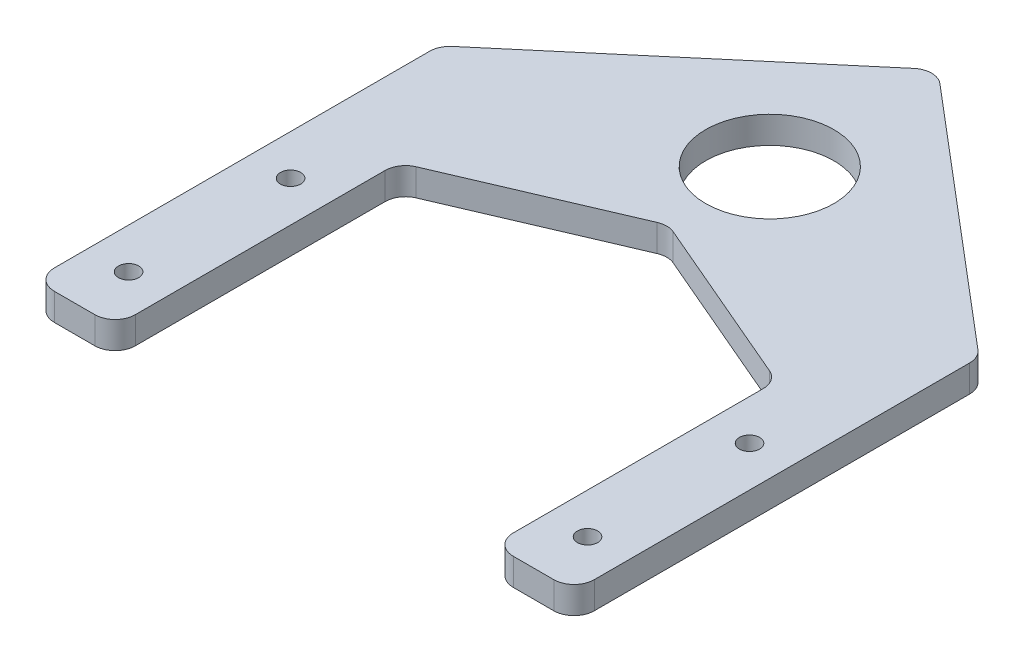
ISO-10303-21;
HEADER;
FILE_DESCRIPTION(('STEP AP214'),'2;1');
FILE_NAME('part.step','',(''),(''),'','','');
FILE_SCHEMA(('AUTOMOTIVE_DESIGN { 1 0 10303 214 1 1 1 1 }'));
ENDSEC;
DATA;
#1=APPLICATION_CONTEXT('core data for automotive mechanical design processes');
#2=APPLICATION_PROTOCOL_DEFINITION('international standard','automotive_design',2000,#1);
#3=PRODUCT_CONTEXT('',#1,'mechanical');
#4=PRODUCT('Part','Part','',(#3));
#5=PRODUCT_RELATED_PRODUCT_CATEGORY('part','',(#4));
#6=PRODUCT_DEFINITION_FORMATION('','',#4);
#7=PRODUCT_DEFINITION_CONTEXT('part definition',#1,'design');
#8=PRODUCT_DEFINITION('design','',#6,#7);
#9=PRODUCT_DEFINITION_SHAPE('','',#8);
#10=(LENGTH_UNIT() NAMED_UNIT(*) SI_UNIT(.MILLI.,.METRE.));
#11=(NAMED_UNIT(*) PLANE_ANGLE_UNIT() SI_UNIT($,.RADIAN.));
#12=(NAMED_UNIT(*) SI_UNIT($,.STERADIAN.) SOLID_ANGLE_UNIT());
#13=UNCERTAINTY_MEASURE_WITH_UNIT(LENGTH_MEASURE(1.E-05),#10,'distance_accuracy_value','');
#14=(GEOMETRIC_REPRESENTATION_CONTEXT(3) GLOBAL_UNCERTAINTY_ASSIGNED_CONTEXT((#13)) GLOBAL_UNIT_ASSIGNED_CONTEXT((#10,
#11,#12)) REPRESENTATION_CONTEXT('',''));
#15=CARTESIAN_POINT('',(0.,0.,0.));
#16=DIRECTION('',(0.,0.,1.));
#17=DIRECTION('',(1.,0.,0.));
#18=AXIS2_PLACEMENT_3D('',#15,#16,#17);
#19=CARTESIAN_POINT('',(0.,4.,0.));
#20=DIRECTION('',(0.,-1.,0.));
#21=DIRECTION('',(0.,0.,-1.));
#22=AXIS2_PLACEMENT_3D('',#19,#20,#21);
#23=PLANE('',#22);
#24=DIRECTION('',(0.,0.,1.));
#25=VECTOR('',#24,1.);
#26=CARTESIAN_POINT('',(0.,4.,0.));
#27=LINE('',#26,#25);
#28=CARTESIAN_POINT('',(0.,4.,-58.6102472415676));
#29=VERTEX_POINT('',#28);
#30=CARTESIAN_POINT('',(0.,4.,-3.));
#31=VERTEX_POINT('',#30);
#32=EDGE_CURVE('E220',#29,#31,#27,.T.);
#33=ORIENTED_EDGE('',*,*,#32,.T.);
#34=CARTESIAN_POINT('',(3.,4.,-3.));
#35=DIRECTION('',(0.,-1.,0.));
#36=DIRECTION('',(0.,0.,-1.));
#37=AXIS2_PLACEMENT_3D('',#34,#35,#36);
#38=CIRCLE('',#37,3.);
#39=CARTESIAN_POINT('',(3.,4.,0.));
#40=VERTEX_POINT('',#39);
#41=EDGE_CURVE('E264',#31,#40,#38,.F.);
#42=ORIENTED_EDGE('',*,*,#41,.T.);
#43=DIRECTION('',(1.,0.,0.));
#44=VECTOR('',#43,1.);
#45=CARTESIAN_POINT('',(12.,4.,0.));
#46=LINE('',#45,#44);
#47=CARTESIAN_POINT('',(9.,4.,0.));
#48=VERTEX_POINT('',#47);
#49=EDGE_CURVE('E200',#40,#48,#46,.T.);
#50=ORIENTED_EDGE('',*,*,#49,.T.);
#51=CARTESIAN_POINT('',(9.,4.,-3.));
#52=DIRECTION('',(0.,-1.,0.));
#53=DIRECTION('',(0.,0.,-1.));
#54=AXIS2_PLACEMENT_3D('',#51,#52,#53);
#55=CIRCLE('',#54,3.);
#56=CARTESIAN_POINT('',(12.,4.,-3.00000000000002));
#57=VERTEX_POINT('',#56);
#58=EDGE_CURVE('E254',#48,#57,#55,.F.);
#59=ORIENTED_EDGE('',*,*,#58,.T.);
#60=DIRECTION('',(0.,0.,-1.));
#61=VECTOR('',#60,1.);
#62=CARTESIAN_POINT('',(12.,4.,-42.));
#63=LINE('',#62,#61);
#64=CARTESIAN_POINT('',(12.,4.,-40.0218115260583));
#65=VERTEX_POINT('',#64);
#66=EDGE_CURVE('E329',#57,#65,#63,.T.);
#67=ORIENTED_EDGE('',*,*,#66,.T.);
#68=CARTESIAN_POINT('',(15.,4.,-40.0218115260583));
#69=DIRECTION('',(0.,-1.,0.));
#70=DIRECTION('',(0.,0.,-1.));
#71=AXIS2_PLACEMENT_3D('',#68,#69,#70);
#72=CIRCLE('',#71,3.);
#73=CARTESIAN_POINT('',(13.8182421042625,4.,-42.7792466161125));
#74=VERTEX_POINT('',#73);
#75=EDGE_CURVE('E11',#65,#74,#72,.T.);
#76=ORIENTED_EDGE('',*,*,#75,.T.);
#77=DIRECTION('',(0.919145030018058,0.,-0.393919298579168));
#78=VECTOR('',#77,1.);
#79=CARTESIAN_POINT('',(12.,4.,-42.));
#80=LINE('',#79,#78);
#81=CARTESIAN_POINT('',(38.8182421042625,4.,-53.4935323303982));
#82=VERTEX_POINT('',#81);
#83=EDGE_CURVE('E327',#74,#82,#80,.T.);
#84=ORIENTED_EDGE('',*,*,#83,.T.);
#85=CARTESIAN_POINT('',(40.,4.,-50.736097240344));
#86=DIRECTION('',(0.,-1.,0.));
#87=DIRECTION('',(0.,0.,-1.));
#88=AXIS2_PLACEMENT_3D('',#85,#86,#87);
#89=CIRCLE('',#88,3.);
#90=CARTESIAN_POINT('',(41.1817578957375,4.,-53.4935323303982));
#91=VERTEX_POINT('',#90);
#92=EDGE_CURVE('E315',#82,#91,#89,.T.);
#93=ORIENTED_EDGE('',*,*,#92,.T.);
#94=DIRECTION('',(0.919145030018058,0.,0.393919298579168));
#95=VECTOR('',#94,1.);
#96=CARTESIAN_POINT('',(40.,4.,-54.));
#97=LINE('',#96,#95);
#98=CARTESIAN_POINT('',(66.1817578957375,4.,-42.7792466161125));
#99=VERTEX_POINT('',#98);
#100=EDGE_CURVE('E331',#91,#99,#97,.T.);
#101=ORIENTED_EDGE('',*,*,#100,.T.);
#102=CARTESIAN_POINT('',(65.,4.,-40.0218115260583));
#103=DIRECTION('',(0.,-1.,0.));
#104=DIRECTION('',(0.,0.,-1.));
#105=AXIS2_PLACEMENT_3D('',#102,#103,#104);
#106=CIRCLE('',#105,3.);
#107=CARTESIAN_POINT('',(68.,4.,-40.0218115260583));
#108=VERTEX_POINT('',#107);
#109=EDGE_CURVE('E306',#99,#108,#106,.T.);
#110=ORIENTED_EDGE('',*,*,#109,.T.);
#111=DIRECTION('',(0.,0.,1.));
#112=VECTOR('',#111,1.);
#113=CARTESIAN_POINT('',(68.,4.,0.));
#114=LINE('',#113,#112);
#115=CARTESIAN_POINT('',(68.,4.,-3.00000000000001));
#116=VERTEX_POINT('',#115);
#117=EDGE_CURVE('E340',#108,#116,#114,.T.);
#118=ORIENTED_EDGE('',*,*,#117,.T.);
#119=CARTESIAN_POINT('',(71.,4.,-3.00000000000001));
#120=DIRECTION('',(0.,-1.,0.));
#121=DIRECTION('',(0.,0.,-1.));
#122=AXIS2_PLACEMENT_3D('',#119,#120,#121);
#123=CIRCLE('',#122,3.);
#124=CARTESIAN_POINT('',(71.,4.,0.));
#125=VERTEX_POINT('',#124);
#126=EDGE_CURVE('E260',#116,#125,#123,.F.);
#127=ORIENTED_EDGE('',*,*,#126,.T.);
#128=DIRECTION('',(1.,0.,0.));
#129=VECTOR('',#128,1.);
#130=CARTESIAN_POINT('',(80.,4.,0.));
#131=LINE('',#130,#129);
#132=CARTESIAN_POINT('',(77.,4.,0.));
#133=VERTEX_POINT('',#132);
#134=EDGE_CURVE('E343',#125,#133,#131,.T.);
#135=ORIENTED_EDGE('',*,*,#134,.T.);
#136=CARTESIAN_POINT('',(77.,4.,-3.00000000000001));
#137=DIRECTION('',(0.,-1.,0.));
#138=DIRECTION('',(0.,0.,-1.));
#139=AXIS2_PLACEMENT_3D('',#136,#137,#138);
#140=CIRCLE('',#139,3.);
#141=CARTESIAN_POINT('',(80.,4.,-3.00000000000002));
#142=VERTEX_POINT('',#141);
#143=EDGE_CURVE('E259',#133,#142,#140,.F.);
#144=ORIENTED_EDGE('',*,*,#143,.T.);
#145=DIRECTION('',(0.,0.,-1.));
#146=VECTOR('',#145,1.);
#147=CARTESIAN_POINT('',(80.,4.,-60.));
#148=LINE('',#147,#146);
#149=CARTESIAN_POINT('',(80.,4.,-58.6102472415676));
#150=VERTEX_POINT('',#149);
#151=EDGE_CURVE('E350',#142,#150,#148,.T.);
#152=ORIENTED_EDGE('',*,*,#151,.T.);
#153=CARTESIAN_POINT('',(77.,4.,-58.6102472415676));
#154=DIRECTION('',(0.,-1.,0.));
#155=DIRECTION('',(0.,0.,-1.));
#156=AXIS2_PLACEMENT_3D('',#153,#154,#155);
#157=CIRCLE('',#156,3.);
#158=CARTESIAN_POINT('',(78.9398921562924,4.,-60.8986568250896));
#159=VERTEX_POINT('',#158);
#160=EDGE_CURVE('E261',#150,#159,#157,.F.);
#161=ORIENTED_EDGE('',*,*,#160,.T.);
#162=DIRECTION('',(-0.762803194507315,0.,-0.646630718764146));
#163=VECTOR('',#162,1.);
#164=CARTESIAN_POINT('',(40.,4.,-93.9081285144222));
#165=LINE('',#164,#163);
#166=CARTESIAN_POINT('',(41.9398921562924,4.,-92.2636757009301));
#167=VERTEX_POINT('',#166);
#168=EDGE_CURVE('E348',#159,#167,#165,.T.);
#169=ORIENTED_EDGE('',*,*,#168,.T.);
#170=CARTESIAN_POINT('',(40.,4.,-89.9752661174082));
#171=DIRECTION('',(0.,-1.,0.));
#172=DIRECTION('',(0.,0.,-1.));
#173=AXIS2_PLACEMENT_3D('',#170,#171,#172);
#174=CIRCLE('',#173,3.);
#175=CARTESIAN_POINT('',(38.0601078437076,4.,-92.2636757009301));
#176=VERTEX_POINT('',#175);
#177=EDGE_CURVE('E61',#167,#176,#174,.F.);
#178=ORIENTED_EDGE('',*,*,#177,.T.);
#179=DIRECTION('',(-0.762803194507315,0.,0.646630718764146));
#180=VECTOR('',#179,1.);
#181=CARTESIAN_POINT('',(0.,4.,-60.));
#182=LINE('',#181,#180);
#183=CARTESIAN_POINT('',(1.06010784370756,4.,-60.8986568250896));
#184=VERTEX_POINT('',#183);
#185=EDGE_CURVE('E353',#176,#184,#182,.T.);
#186=ORIENTED_EDGE('',*,*,#185,.T.);
#187=CARTESIAN_POINT('',(3.,4.,-58.6102472415676));
#188=DIRECTION('',(0.,-1.,0.));
#189=DIRECTION('',(0.,0.,-1.));
#190=AXIS2_PLACEMENT_3D('',#187,#188,#189);
#191=CIRCLE('',#190,3.);
#192=EDGE_CURVE('E263',#184,#29,#191,.F.);
#193=ORIENTED_EDGE('',*,*,#192,.T.);
#194=EDGE_LOOP('',(#33,#42,#50,#59,#67,#76,#84,#93,#101,#110,#118,#127,#135,#144,#152,#161,#169,
#178,#186,#193));
#195=FACE_BOUND('',#194,.T.);
#196=CARTESIAN_POINT('',(6.,4.,-32.));
#197=DIRECTION('',(0.,1.,0.));
#198=DIRECTION('',(0.,0.,1.));
#199=AXIS2_PLACEMENT_3D('',#196,#197,#198);
#200=CIRCLE('',#199,1.5);
#201=CARTESIAN_POINT('',(6.,4.,-30.5));
#202=VERTEX_POINT('',#201);
#203=EDGE_CURVE('E208',#202,#202,#200,.T.);
#204=ORIENTED_EDGE('',*,*,#203,.F.);
#205=EDGE_LOOP('',(#204));
#206=FACE_BOUND('',#205,.T.);
#207=CARTESIAN_POINT('',(6.,4.,-8.));
#208=DIRECTION('',(0.,1.,0.));
#209=DIRECTION('',(0.,0.,1.));
#210=AXIS2_PLACEMENT_3D('',#207,#208,#209);
#211=CIRCLE('',#210,1.5);
#212=CARTESIAN_POINT('',(6.,4.,-6.5));
#213=VERTEX_POINT('',#212);
#214=EDGE_CURVE('E496',#213,#213,#211,.T.);
#215=ORIENTED_EDGE('',*,*,#214,.F.);
#216=EDGE_LOOP('',(#215));
#217=FACE_BOUND('',#216,.T.);
#218=CARTESIAN_POINT('',(74.,4.,-8.));
#219=DIRECTION('',(0.,1.,0.));
#220=DIRECTION('',(0.,0.,-1.));
#221=AXIS2_PLACEMENT_3D('',#218,#219,#220);
#222=CIRCLE('',#221,1.50000000000001);
#223=CARTESIAN_POINT('',(74.,4.,-9.50000000000001));
#224=VERTEX_POINT('',#223);
#225=EDGE_CURVE('E504',#224,#224,#222,.T.);
#226=ORIENTED_EDGE('',*,*,#225,.F.);
#227=EDGE_LOOP('',(#226));
#228=FACE_BOUND('',#227,.T.);
#229=CARTESIAN_POINT('',(40.,4.,-69.));
#230=DIRECTION('',(0.,1.,0.));
#231=DIRECTION('',(0.,0.,1.));
#232=AXIS2_PLACEMENT_3D('',#229,#230,#231);
#233=CIRCLE('',#232,9.50000000000001);
#234=CARTESIAN_POINT('',(40.,4.,-59.5));
#235=VERTEX_POINT('',#234);
#236=EDGE_CURVE('E509',#235,#235,#233,.T.);
#237=ORIENTED_EDGE('',*,*,#236,.F.);
#238=EDGE_LOOP('',(#237));
#239=FACE_BOUND('',#238,.T.);
#240=CARTESIAN_POINT('',(74.,4.,-32.));
#241=DIRECTION('',(0.,1.,0.));
#242=DIRECTION('',(0.,0.,-1.));
#243=AXIS2_PLACEMENT_3D('',#240,#241,#242);
#244=CIRCLE('',#243,1.50000000000001);
#245=CARTESIAN_POINT('',(74.,4.,-33.5));
#246=VERTEX_POINT('',#245);
#247=EDGE_CURVE('E518',#246,#246,#244,.T.);
#248=ORIENTED_EDGE('',*,*,#247,.F.);
#249=EDGE_LOOP('',(#248));
#250=FACE_BOUND('',#249,.T.);
#251=ADVANCED_FACE('F41',(#195,#206,#217,#228,#239,#250),#23,.F.);
#252=CARTESIAN_POINT('',(0.,0.,0.));
#253=DIRECTION('',(0.,-1.,0.));
#254=DIRECTION('',(0.,0.,-1.));
#255=AXIS2_PLACEMENT_3D('',#252,#253,#254);
#256=PLANE('',#255);
#257=CARTESIAN_POINT('',(40.,0.,-69.));
#258=DIRECTION('',(0.,1.,0.));
#259=DIRECTION('',(0.,0.,1.));
#260=AXIS2_PLACEMENT_3D('',#257,#258,#259);
#261=CIRCLE('',#260,9.50000000000001);
#262=CARTESIAN_POINT('',(40.,0.,-59.5));
#263=VERTEX_POINT('',#262);
#264=EDGE_CURVE('E511',#263,#263,#261,.T.);
#265=ORIENTED_EDGE('',*,*,#264,.T.);
#266=EDGE_LOOP('',(#265));
#267=FACE_BOUND('',#266,.T.);
#268=CARTESIAN_POINT('',(6.,0.,-8.));
#269=DIRECTION('',(0.,1.,0.));
#270=DIRECTION('',(0.,0.,1.));
#271=AXIS2_PLACEMENT_3D('',#268,#269,#270);
#272=CIRCLE('',#271,1.5);
#273=CARTESIAN_POINT('',(6.,0.,-6.5));
#274=VERTEX_POINT('',#273);
#275=EDGE_CURVE('E503',#274,#274,#272,.T.);
#276=ORIENTED_EDGE('',*,*,#275,.T.);
#277=EDGE_LOOP('',(#276));
#278=FACE_BOUND('',#277,.T.);
#279=DIRECTION('',(1.,0.,0.));
#280=VECTOR('',#279,1.);
#281=CARTESIAN_POINT('',(12.,0.,0.));
#282=LINE('',#281,#280);
#283=CARTESIAN_POINT('',(3.,0.,0.));
#284=VERTEX_POINT('',#283);
#285=CARTESIAN_POINT('',(9.,0.,0.));
#286=VERTEX_POINT('',#285);
#287=EDGE_CURVE('E198',#284,#286,#282,.T.);
#288=ORIENTED_EDGE('',*,*,#287,.F.);
#289=CARTESIAN_POINT('',(3.,0.,-3.));
#290=DIRECTION('',(0.,-1.,0.));
#291=DIRECTION('',(0.,0.,-1.));
#292=AXIS2_PLACEMENT_3D('',#289,#290,#291);
#293=CIRCLE('',#292,3.);
#294=CARTESIAN_POINT('',(0.,0.,-3.));
#295=VERTEX_POINT('',#294);
#296=EDGE_CURVE('E178',#284,#295,#293,.T.);
#297=ORIENTED_EDGE('',*,*,#296,.T.);
#298=DIRECTION('',(0.,0.,1.));
#299=VECTOR('',#298,1.);
#300=CARTESIAN_POINT('',(0.,0.,0.));
#301=LINE('',#300,#299);
#302=CARTESIAN_POINT('',(0.,0.,-58.6102472415676));
#303=VERTEX_POINT('',#302);
#304=EDGE_CURVE('E239',#303,#295,#301,.T.);
#305=ORIENTED_EDGE('',*,*,#304,.F.);
#306=CARTESIAN_POINT('',(3.,0.,-58.6102472415676));
#307=DIRECTION('',(0.,-1.,0.));
#308=DIRECTION('',(0.,0.,-1.));
#309=AXIS2_PLACEMENT_3D('',#306,#307,#308);
#310=CIRCLE('',#309,3.);
#311=CARTESIAN_POINT('',(1.06010784370756,0.,-60.8986568250896));
#312=VERTEX_POINT('',#311);
#313=EDGE_CURVE('E187',#303,#312,#310,.T.);
#314=ORIENTED_EDGE('',*,*,#313,.T.);
#315=DIRECTION('',(-0.762803194507315,0.,0.646630718764146));
#316=VECTOR('',#315,1.);
#317=CARTESIAN_POINT('',(0.,0.,-60.));
#318=LINE('',#317,#316);
#319=CARTESIAN_POINT('',(38.0601078437076,0.,-92.2636757009301));
#320=VERTEX_POINT('',#319);
#321=EDGE_CURVE('E240',#320,#312,#318,.T.);
#322=ORIENTED_EDGE('',*,*,#321,.F.);
#323=CARTESIAN_POINT('',(40.,0.,-89.9752661174082));
#324=DIRECTION('',(0.,-1.,0.));
#325=DIRECTION('',(0.,0.,-1.));
#326=AXIS2_PLACEMENT_3D('',#323,#324,#325);
#327=CIRCLE('',#326,3.);
#328=CARTESIAN_POINT('',(41.9398921562924,0.,-92.2636757009301));
#329=VERTEX_POINT('',#328);
#330=EDGE_CURVE('E199',#320,#329,#327,.T.);
#331=ORIENTED_EDGE('',*,*,#330,.T.);
#332=DIRECTION('',(-0.762803194507315,0.,-0.646630718764146));
#333=VECTOR('',#332,1.);
#334=CARTESIAN_POINT('',(40.,0.,-93.9081285144222));
#335=LINE('',#334,#333);
#336=CARTESIAN_POINT('',(78.9398921562924,0.,-60.8986568250896));
#337=VERTEX_POINT('',#336);
#338=EDGE_CURVE('E233',#337,#329,#335,.T.);
#339=ORIENTED_EDGE('',*,*,#338,.F.);
#340=CARTESIAN_POINT('',(77.,0.,-58.6102472415676));
#341=DIRECTION('',(0.,-1.,0.));
#342=DIRECTION('',(0.,0.,-1.));
#343=AXIS2_PLACEMENT_3D('',#340,#341,#342);
#344=CIRCLE('',#343,3.);
#345=CARTESIAN_POINT('',(80.,0.,-58.6102472415676));
#346=VERTEX_POINT('',#345);
#347=EDGE_CURVE('E247',#337,#346,#344,.T.);
#348=ORIENTED_EDGE('',*,*,#347,.T.);
#349=DIRECTION('',(0.,0.,-1.));
#350=VECTOR('',#349,1.);
#351=CARTESIAN_POINT('',(80.,0.,-60.));
#352=LINE('',#351,#350);
#353=CARTESIAN_POINT('',(80.,0.,-3.00000000000002));
#354=VERTEX_POINT('',#353);
#355=EDGE_CURVE('E231',#354,#346,#352,.T.);
#356=ORIENTED_EDGE('',*,*,#355,.F.);
#357=CARTESIAN_POINT('',(77.,0.,-3.00000000000001));
#358=DIRECTION('',(0.,-1.,0.));
#359=DIRECTION('',(0.,0.,-1.));
#360=AXIS2_PLACEMENT_3D('',#357,#358,#359);
#361=CIRCLE('',#360,3.);
#362=CARTESIAN_POINT('',(77.,0.,0.));
#363=VERTEX_POINT('',#362);
#364=EDGE_CURVE('E246',#354,#363,#361,.T.);
#365=ORIENTED_EDGE('',*,*,#364,.T.);
#366=DIRECTION('',(1.,0.,0.));
#367=VECTOR('',#366,1.);
#368=CARTESIAN_POINT('',(80.,0.,0.));
#369=LINE('',#368,#367);
#370=CARTESIAN_POINT('',(71.,0.,0.));
#371=VERTEX_POINT('',#370);
#372=EDGE_CURVE('E226',#371,#363,#369,.T.);
#373=ORIENTED_EDGE('',*,*,#372,.F.);
#374=CARTESIAN_POINT('',(71.,0.,-3.00000000000001));
#375=DIRECTION('',(0.,-1.,0.));
#376=DIRECTION('',(0.,0.,-1.));
#377=AXIS2_PLACEMENT_3D('',#374,#375,#376);
#378=CIRCLE('',#377,3.);
#379=CARTESIAN_POINT('',(68.,0.,-3.00000000000001));
#380=VERTEX_POINT('',#379);
#381=EDGE_CURVE('E244',#371,#380,#378,.T.);
#382=ORIENTED_EDGE('',*,*,#381,.T.);
#383=DIRECTION('',(0.,0.,1.));
#384=VECTOR('',#383,1.);
#385=CARTESIAN_POINT('',(68.,0.,0.));
#386=LINE('',#385,#384);
#387=CARTESIAN_POINT('',(68.,0.,-40.0218115260583));
#388=VERTEX_POINT('',#387);
#389=EDGE_CURVE('E223',#388,#380,#386,.T.);
#390=ORIENTED_EDGE('',*,*,#389,.F.);
#391=CARTESIAN_POINT('',(65.,0.,-40.0218115260583));
#392=DIRECTION('',(0.,-1.,0.));
#393=DIRECTION('',(0.,0.,-1.));
#394=AXIS2_PLACEMENT_3D('',#391,#392,#393);
#395=CIRCLE('',#394,3.);
#396=CARTESIAN_POINT('',(66.1817578957375,0.,-42.7792466161125));
#397=VERTEX_POINT('',#396);
#398=EDGE_CURVE('E308',#388,#397,#395,.F.);
#399=ORIENTED_EDGE('',*,*,#398,.T.);
#400=DIRECTION('',(0.919145030018058,0.,0.393919298579168));
#401=VECTOR('',#400,1.);
#402=CARTESIAN_POINT('',(40.,0.,-54.));
#403=LINE('',#402,#401);
#404=CARTESIAN_POINT('',(41.1817578957375,0.,-53.4935323303982));
#405=VERTEX_POINT('',#404);
#406=EDGE_CURVE('E225',#405,#397,#403,.T.);
#407=ORIENTED_EDGE('',*,*,#406,.F.);
#408=CARTESIAN_POINT('',(40.,0.,-50.736097240344));
#409=DIRECTION('',(0.,-1.,0.));
#410=DIRECTION('',(0.,0.,-1.));
#411=AXIS2_PLACEMENT_3D('',#408,#409,#410);
#412=CIRCLE('',#411,3.);
#413=CARTESIAN_POINT('',(38.8182421042625,0.,-53.4935323303982));
#414=VERTEX_POINT('',#413);
#415=EDGE_CURVE('E309',#405,#414,#412,.F.);
#416=ORIENTED_EDGE('',*,*,#415,.T.);
#417=DIRECTION('',(0.919145030018058,0.,-0.393919298579168));
#418=VECTOR('',#417,1.);
#419=CARTESIAN_POINT('',(12.,0.,-42.));
#420=LINE('',#419,#418);
#421=CARTESIAN_POINT('',(13.8182421042625,0.,-42.7792466161125));
#422=VERTEX_POINT('',#421);
#423=EDGE_CURVE('E211',#422,#414,#420,.T.);
#424=ORIENTED_EDGE('',*,*,#423,.F.);
#425=CARTESIAN_POINT('',(15.,0.,-40.0218115260583));
#426=DIRECTION('',(0.,-1.,0.));
#427=DIRECTION('',(0.,0.,-1.));
#428=AXIS2_PLACEMENT_3D('',#425,#426,#427);
#429=CIRCLE('',#428,3.);
#430=CARTESIAN_POINT('',(12.,0.,-40.0218115260583));
#431=VERTEX_POINT('',#430);
#432=EDGE_CURVE('E47',#422,#431,#429,.F.);
#433=ORIENTED_EDGE('',*,*,#432,.T.);
#434=DIRECTION('',(0.,0.,-1.));
#435=VECTOR('',#434,1.);
#436=CARTESIAN_POINT('',(12.,0.,-42.));
#437=LINE('',#436,#435);
#438=CARTESIAN_POINT('',(12.,0.,-3.00000000000002));
#439=VERTEX_POINT('',#438);
#440=EDGE_CURVE('E210',#439,#431,#437,.T.);
#441=ORIENTED_EDGE('',*,*,#440,.F.);
#442=CARTESIAN_POINT('',(9.,0.,-3.));
#443=DIRECTION('',(0.,-1.,0.));
#444=DIRECTION('',(0.,0.,-1.));
#445=AXIS2_PLACEMENT_3D('',#442,#443,#444);
#446=CIRCLE('',#445,3.);
#447=EDGE_CURVE('E206',#439,#286,#446,.T.);
#448=ORIENTED_EDGE('',*,*,#447,.T.);
#449=EDGE_LOOP('',(#288,#297,#305,#314,#322,#331,#339,#348,#356,#365,#373,#382,#390,#399,#407,
#416,#424,#433,#441,#448));
#450=FACE_BOUND('',#449,.T.);
#451=CARTESIAN_POINT('',(6.,0.,-32.));
#452=DIRECTION('',(0.,1.,0.));
#453=DIRECTION('',(0.,0.,1.));
#454=AXIS2_PLACEMENT_3D('',#451,#452,#453);
#455=CIRCLE('',#454,1.5);
#456=CARTESIAN_POINT('',(6.,0.,-30.5));
#457=VERTEX_POINT('',#456);
#458=EDGE_CURVE('E212',#457,#457,#455,.T.);
#459=ORIENTED_EDGE('',*,*,#458,.T.);
#460=EDGE_LOOP('',(#459));
#461=FACE_BOUND('',#460,.T.);
#462=CARTESIAN_POINT('',(74.,0.,-8.));
#463=DIRECTION('',(0.,1.,0.));
#464=DIRECTION('',(0.,0.,-1.));
#465=AXIS2_PLACEMENT_3D('',#462,#463,#464);
#466=CIRCLE('',#465,1.50000000000001);
#467=CARTESIAN_POINT('',(74.,0.,-9.50000000000001));
#468=VERTEX_POINT('',#467);
#469=EDGE_CURVE('E510',#468,#468,#466,.T.);
#470=ORIENTED_EDGE('',*,*,#469,.T.);
#471=EDGE_LOOP('',(#470));
#472=FACE_BOUND('',#471,.T.);
#473=CARTESIAN_POINT('',(74.,0.,-32.));
#474=DIRECTION('',(0.,1.,0.));
#475=DIRECTION('',(0.,0.,-1.));
#476=AXIS2_PLACEMENT_3D('',#473,#474,#475);
#477=CIRCLE('',#476,1.50000000000001);
#478=CARTESIAN_POINT('',(74.,0.,-33.5));
#479=VERTEX_POINT('',#478);
#480=EDGE_CURVE('E519',#479,#479,#477,.T.);
#481=ORIENTED_EDGE('',*,*,#480,.T.);
#482=EDGE_LOOP('',(#481));
#483=FACE_BOUND('',#482,.T.);
#484=ADVANCED_FACE('F201',(#267,#278,#450,#461,#472,#483),#256,.T.);
#485=CARTESIAN_POINT('',(12.,4.,0.));
#486=DIRECTION('',(0.,0.,-1.));
#487=DIRECTION('',(-1.,0.,0.));
#488=AXIS2_PLACEMENT_3D('',#485,#486,#487);
#489=PLANE('',#488);
#490=ORIENTED_EDGE('',*,*,#49,.F.);
#491=DIRECTION('',(0.,-1.,0.));
#492=VECTOR('',#491,1.);
#493=CARTESIAN_POINT('',(3.,4.,0.));
#494=LINE('',#493,#492);
#495=EDGE_CURVE('E181',#40,#284,#494,.T.);
#496=ORIENTED_EDGE('',*,*,#495,.T.);
#497=ORIENTED_EDGE('',*,*,#287,.T.);
#498=DIRECTION('',(0.,-1.,0.));
#499=VECTOR('',#498,1.);
#500=CARTESIAN_POINT('',(9.,4.,0.));
#501=LINE('',#500,#499);
#502=EDGE_CURVE('E203',#286,#48,#501,.F.);
#503=ORIENTED_EDGE('',*,*,#502,.T.);
#504=EDGE_LOOP('',(#490,#496,#497,#503));
#505=FACE_BOUND('',#504,.T.);
#506=ADVANCED_FACE('F194',(#505),#489,.F.);
#507=CARTESIAN_POINT('',(12.,4.,-42.));
#508=DIRECTION('',(-1.,0.,0.));
#509=DIRECTION('',(0.,0.,1.));
#510=AXIS2_PLACEMENT_3D('',#507,#508,#509);
#511=PLANE('',#510);
#512=ORIENTED_EDGE('',*,*,#440,.T.);
#513=DIRECTION('',(0.,-1.,0.));
#514=VECTOR('',#513,1.);
#515=CARTESIAN_POINT('',(12.,4.,-40.0218115260583));
#516=LINE('',#515,#514);
#517=EDGE_CURVE('E303',#431,#65,#516,.F.);
#518=ORIENTED_EDGE('',*,*,#517,.T.);
#519=ORIENTED_EDGE('',*,*,#66,.F.);
#520=DIRECTION('',(0.,-1.,0.));
#521=VECTOR('',#520,1.);
#522=CARTESIAN_POINT('',(12.,4.,-3.));
#523=LINE('',#522,#521);
#524=EDGE_CURVE('E301',#57,#439,#523,.T.);
#525=ORIENTED_EDGE('',*,*,#524,.T.);
#526=EDGE_LOOP('',(#512,#518,#519,#525));
#527=FACE_BOUND('',#526,.T.);
#528=ADVANCED_FACE('F318',(#527),#511,.F.);
#529=CARTESIAN_POINT('',(12.,4.,-42.));
#530=DIRECTION('',(-0.393919298579168,0.,-0.919145030018058));
#531=DIRECTION('',(-0.919145030018058,0.,0.393919298579168));
#532=AXIS2_PLACEMENT_3D('',#529,#530,#531);
#533=PLANE('',#532);
#534=ORIENTED_EDGE('',*,*,#423,.T.);
#535=DIRECTION('',(0.,-1.,0.));
#536=VECTOR('',#535,1.);
#537=CARTESIAN_POINT('',(38.8182421042625,4.,-53.4935323303982));
#538=LINE('',#537,#536);
#539=EDGE_CURVE('E299',#414,#82,#538,.F.);
#540=ORIENTED_EDGE('',*,*,#539,.T.);
#541=ORIENTED_EDGE('',*,*,#83,.F.);
#542=DIRECTION('',(0.,-1.,0.));
#543=VECTOR('',#542,1.);
#544=CARTESIAN_POINT('',(13.8182421042625,0.,-42.7792466161125));
#545=LINE('',#544,#543);
#546=EDGE_CURVE('E298',#74,#422,#545,.T.);
#547=ORIENTED_EDGE('',*,*,#546,.T.);
#548=EDGE_LOOP('',(#534,#540,#541,#547));
#549=FACE_BOUND('',#548,.T.);
#550=ADVANCED_FACE('F335',(#549),#533,.F.);
#551=CARTESIAN_POINT('',(40.,4.,-54.));
#552=DIRECTION('',(0.393919298579168,0.,-0.919145030018058));
#553=DIRECTION('',(-0.919145030018058,0.,-0.393919298579168));
#554=AXIS2_PLACEMENT_3D('',#551,#552,#553);
#555=PLANE('',#554);
#556=ORIENTED_EDGE('',*,*,#406,.T.);
#557=DIRECTION('',(0.,-1.,0.));
#558=VECTOR('',#557,1.);
#559=CARTESIAN_POINT('',(66.1817578957375,4.,-42.7792466161125));
#560=LINE('',#559,#558);
#561=EDGE_CURVE('E294',#397,#99,#560,.F.);
#562=ORIENTED_EDGE('',*,*,#561,.T.);
#563=ORIENTED_EDGE('',*,*,#100,.F.);
#564=DIRECTION('',(0.,-1.,0.));
#565=VECTOR('',#564,1.);
#566=CARTESIAN_POINT('',(41.1817578957375,0.,-53.4935323303982));
#567=LINE('',#566,#565);
#568=EDGE_CURVE('E292',#91,#405,#567,.T.);
#569=ORIENTED_EDGE('',*,*,#568,.T.);
#570=EDGE_LOOP('',(#556,#562,#563,#569));
#571=FACE_BOUND('',#570,.T.);
#572=ADVANCED_FACE('F405',(#571),#555,.F.);
#573=CARTESIAN_POINT('',(68.,4.,0.));
#574=DIRECTION('',(1.,0.,0.));
#575=DIRECTION('',(0.,0.,-1.));
#576=AXIS2_PLACEMENT_3D('',#573,#574,#575);
#577=PLANE('',#576);
#578=ORIENTED_EDGE('',*,*,#389,.T.);
#579=DIRECTION('',(0.,-1.,0.));
#580=VECTOR('',#579,1.);
#581=CARTESIAN_POINT('',(68.,4.,-3.00000000000001));
#582=LINE('',#581,#580);
#583=EDGE_CURVE('E288',#380,#116,#582,.F.);
#584=ORIENTED_EDGE('',*,*,#583,.T.);
#585=ORIENTED_EDGE('',*,*,#117,.F.);
#586=DIRECTION('',(0.,-1.,0.));
#587=VECTOR('',#586,1.);
#588=CARTESIAN_POINT('',(68.,0.,-40.0218115260583));
#589=LINE('',#588,#587);
#590=EDGE_CURVE('E286',#108,#388,#589,.T.);
#591=ORIENTED_EDGE('',*,*,#590,.T.);
#592=EDGE_LOOP('',(#578,#584,#585,#591));
#593=FACE_BOUND('',#592,.T.);
#594=ADVANCED_FACE('F391',(#593),#577,.F.);
#595=CARTESIAN_POINT('',(80.,4.,0.));
#596=DIRECTION('',(0.,0.,-1.));
#597=DIRECTION('',(-1.,0.,0.));
#598=AXIS2_PLACEMENT_3D('',#595,#596,#597);
#599=PLANE('',#598);
#600=ORIENTED_EDGE('',*,*,#372,.T.);
#601=DIRECTION('',(0.,-1.,0.));
#602=VECTOR('',#601,1.);
#603=CARTESIAN_POINT('',(77.,4.,0.));
#604=LINE('',#603,#602);
#605=EDGE_CURVE('E284',#363,#133,#604,.F.);
#606=ORIENTED_EDGE('',*,*,#605,.T.);
#607=ORIENTED_EDGE('',*,*,#134,.F.);
#608=DIRECTION('',(0.,-1.,0.));
#609=VECTOR('',#608,1.);
#610=CARTESIAN_POINT('',(71.,4.,0.));
#611=LINE('',#610,#609);
#612=EDGE_CURVE('E283',#125,#371,#611,.T.);
#613=ORIENTED_EDGE('',*,*,#612,.T.);
#614=EDGE_LOOP('',(#600,#606,#607,#613));
#615=FACE_BOUND('',#614,.T.);
#616=ADVANCED_FACE('F383',(#615),#599,.F.);
#617=CARTESIAN_POINT('',(80.,4.,-60.));
#618=DIRECTION('',(-1.,0.,0.));
#619=DIRECTION('',(0.,0.,1.));
#620=AXIS2_PLACEMENT_3D('',#617,#618,#619);
#621=PLANE('',#620);
#622=ORIENTED_EDGE('',*,*,#355,.T.);
#623=DIRECTION('',(0.,-1.,0.));
#624=VECTOR('',#623,1.);
#625=CARTESIAN_POINT('',(80.,4.,-58.6102472415676));
#626=LINE('',#625,#624);
#627=EDGE_CURVE('E276',#346,#150,#626,.F.);
#628=ORIENTED_EDGE('',*,*,#627,.T.);
#629=ORIENTED_EDGE('',*,*,#151,.F.);
#630=DIRECTION('',(0.,-1.,0.));
#631=VECTOR('',#630,1.);
#632=CARTESIAN_POINT('',(80.,4.,-3.00000000000001));
#633=LINE('',#632,#631);
#634=EDGE_CURVE('E277',#142,#354,#633,.T.);
#635=ORIENTED_EDGE('',*,*,#634,.T.);
#636=EDGE_LOOP('',(#622,#628,#629,#635));
#637=FACE_BOUND('',#636,.T.);
#638=ADVANCED_FACE('F374',(#637),#621,.F.);
#639=CARTESIAN_POINT('',(40.,4.,-93.9081285144222));
#640=DIRECTION('',(-0.646630718764146,0.,0.762803194507315));
#641=DIRECTION('',(0.762803194507315,0.,0.646630718764146));
#642=AXIS2_PLACEMENT_3D('',#639,#640,#641);
#643=PLANE('',#642);
#644=ORIENTED_EDGE('',*,*,#168,.F.);
#645=DIRECTION('',(0.,-1.,0.));
#646=VECTOR('',#645,1.);
#647=CARTESIAN_POINT('',(78.9398921562924,4.,-60.8986568250896));
#648=LINE('',#647,#646);
#649=EDGE_CURVE('E272',#159,#337,#648,.T.);
#650=ORIENTED_EDGE('',*,*,#649,.T.);
#651=ORIENTED_EDGE('',*,*,#338,.T.);
#652=DIRECTION('',(0.,-1.,0.));
#653=VECTOR('',#652,1.);
#654=CARTESIAN_POINT('',(41.9398921562924,4.,-92.2636757009301));
#655=LINE('',#654,#653);
#656=EDGE_CURVE('E271',#329,#167,#655,.F.);
#657=ORIENTED_EDGE('',*,*,#656,.T.);
#658=EDGE_LOOP('',(#644,#650,#651,#657));
#659=FACE_BOUND('',#658,.T.);
#660=ADVANCED_FACE('F370',(#659),#643,.F.);
#661=CARTESIAN_POINT('',(0.,4.,-60.));
#662=DIRECTION('',(0.646630718764146,0.,0.762803194507315));
#663=DIRECTION('',(0.762803194507315,0.,-0.646630718764146));
#664=AXIS2_PLACEMENT_3D('',#661,#662,#663);
#665=PLANE('',#664);
#666=ORIENTED_EDGE('',*,*,#321,.T.);
#667=DIRECTION('',(0.,-1.,0.));
#668=VECTOR('',#667,1.);
#669=CARTESIAN_POINT('',(1.06010784370756,4.,-60.8986568250896));
#670=LINE('',#669,#668);
#671=EDGE_CURVE('E57',#312,#184,#670,.F.);
#672=ORIENTED_EDGE('',*,*,#671,.T.);
#673=ORIENTED_EDGE('',*,*,#185,.F.);
#674=DIRECTION('',(0.,-1.,0.));
#675=VECTOR('',#674,1.);
#676=CARTESIAN_POINT('',(38.0601078437076,4.,-92.2636757009301));
#677=LINE('',#676,#675);
#678=EDGE_CURVE('E270',#176,#320,#677,.T.);
#679=ORIENTED_EDGE('',*,*,#678,.T.);
#680=EDGE_LOOP('',(#666,#672,#673,#679));
#681=FACE_BOUND('',#680,.T.);
#682=ADVANCED_FACE('F359',(#681),#665,.F.);
#683=CARTESIAN_POINT('',(0.,4.,0.));
#684=DIRECTION('',(1.,0.,0.));
#685=DIRECTION('',(0.,0.,-1.));
#686=AXIS2_PLACEMENT_3D('',#683,#684,#685);
#687=PLANE('',#686);
#688=ORIENTED_EDGE('',*,*,#304,.T.);
#689=DIRECTION('',(0.,-1.,0.));
#690=VECTOR('',#689,1.);
#691=CARTESIAN_POINT('',(0.,4.,-3.));
#692=LINE('',#691,#690);
#693=EDGE_CURVE('E184',#295,#31,#692,.F.);
#694=ORIENTED_EDGE('',*,*,#693,.T.);
#695=ORIENTED_EDGE('',*,*,#32,.F.);
#696=DIRECTION('',(0.,-1.,0.));
#697=VECTOR('',#696,1.);
#698=CARTESIAN_POINT('',(0.,4.,-58.6102472415676));
#699=LINE('',#698,#697);
#700=EDGE_CURVE('E189',#29,#303,#699,.T.);
#701=ORIENTED_EDGE('',*,*,#700,.T.);
#702=EDGE_LOOP('',(#688,#694,#695,#701));
#703=FACE_BOUND('',#702,.T.);
#704=ADVANCED_FACE('F356',(#703),#687,.F.);
#705=CARTESIAN_POINT('',(6.,4.,-32.));
#706=DIRECTION('',(0.,-1.,0.));
#707=DIRECTION('',(0.,0.,-1.));
#708=AXIS2_PLACEMENT_3D('',#705,#706,#707);
#709=CYLINDRICAL_SURFACE('',#708,1.5);
#710=ORIENTED_EDGE('',*,*,#203,.T.);
#711=EDGE_LOOP('',(#710));
#712=FACE_BOUND('',#711,.T.);
#713=ORIENTED_EDGE('',*,*,#458,.F.);
#714=EDGE_LOOP('',(#713));
#715=FACE_BOUND('',#714,.T.);
#716=ADVANCED_FACE('F422',(#712,#715),#709,.F.);
#717=CARTESIAN_POINT('',(6.,4.,-8.));
#718=DIRECTION('',(0.,-1.,0.));
#719=DIRECTION('',(0.,0.,-1.));
#720=AXIS2_PLACEMENT_3D('',#717,#718,#719);
#721=CYLINDRICAL_SURFACE('',#720,1.5);
#722=ORIENTED_EDGE('',*,*,#214,.T.);
#723=EDGE_LOOP('',(#722));
#724=FACE_BOUND('',#723,.T.);
#725=ORIENTED_EDGE('',*,*,#275,.F.);
#726=EDGE_LOOP('',(#725));
#727=FACE_BOUND('',#726,.T.);
#728=ADVANCED_FACE('F537',(#724,#727),#721,.F.);
#729=CARTESIAN_POINT('',(74.,4.,-8.));
#730=DIRECTION('',(0.,-1.,0.));
#731=DIRECTION('',(0.,0.,-1.));
#732=AXIS2_PLACEMENT_3D('',#729,#730,#731);
#733=CYLINDRICAL_SURFACE('',#732,1.50000000000001);
#734=ORIENTED_EDGE('',*,*,#225,.T.);
#735=EDGE_LOOP('',(#734));
#736=FACE_BOUND('',#735,.T.);
#737=ORIENTED_EDGE('',*,*,#469,.F.);
#738=EDGE_LOOP('',(#737));
#739=FACE_BOUND('',#738,.T.);
#740=ADVANCED_FACE('F534',(#736,#739),#733,.F.);
#741=CARTESIAN_POINT('',(40.,4.,-69.));
#742=DIRECTION('',(0.,-1.,0.));
#743=DIRECTION('',(0.,0.,-1.));
#744=AXIS2_PLACEMENT_3D('',#741,#742,#743);
#745=CYLINDRICAL_SURFACE('',#744,9.50000000000001);
#746=ORIENTED_EDGE('',*,*,#236,.T.);
#747=EDGE_LOOP('',(#746));
#748=FACE_BOUND('',#747,.T.);
#749=ORIENTED_EDGE('',*,*,#264,.F.);
#750=EDGE_LOOP('',(#749));
#751=FACE_BOUND('',#750,.T.);
#752=ADVANCED_FACE('F527',(#748,#751),#745,.F.);
#753=CARTESIAN_POINT('',(74.,4.,-32.));
#754=DIRECTION('',(0.,-1.,0.));
#755=DIRECTION('',(0.,0.,-1.));
#756=AXIS2_PLACEMENT_3D('',#753,#754,#755);
#757=CYLINDRICAL_SURFACE('',#756,1.50000000000001);
#758=ORIENTED_EDGE('',*,*,#247,.T.);
#759=EDGE_LOOP('',(#758));
#760=FACE_BOUND('',#759,.T.);
#761=ORIENTED_EDGE('',*,*,#480,.F.);
#762=EDGE_LOOP('',(#761));
#763=FACE_BOUND('',#762,.T.);
#764=ADVANCED_FACE('F447',(#760,#763),#757,.F.);
#765=CARTESIAN_POINT('',(3.,4.,-3.));
#766=DIRECTION('',(0.,-1.,0.));
#767=DIRECTION('',(0.,0.,-1.));
#768=AXIS2_PLACEMENT_3D('',#765,#766,#767);
#769=CYLINDRICAL_SURFACE('',#768,3.);
#770=ORIENTED_EDGE('',*,*,#41,.F.);
#771=ORIENTED_EDGE('',*,*,#693,.F.);
#772=ORIENTED_EDGE('',*,*,#296,.F.);
#773=ORIENTED_EDGE('',*,*,#495,.F.);
#774=EDGE_LOOP('',(#770,#771,#772,#773));
#775=FACE_BOUND('',#774,.T.);
#776=ADVANCED_FACE('F185',(#775),#769,.T.);
#777=CARTESIAN_POINT('',(3.,4.,-58.6102472415676));
#778=DIRECTION('',(0.,-1.,0.));
#779=DIRECTION('',(0.,0.,-1.));
#780=AXIS2_PLACEMENT_3D('',#777,#778,#779);
#781=CYLINDRICAL_SURFACE('',#780,3.);
#782=ORIENTED_EDGE('',*,*,#192,.F.);
#783=ORIENTED_EDGE('',*,*,#671,.F.);
#784=ORIENTED_EDGE('',*,*,#313,.F.);
#785=ORIENTED_EDGE('',*,*,#700,.F.);
#786=EDGE_LOOP('',(#782,#783,#784,#785));
#787=FACE_BOUND('',#786,.T.);
#788=ADVANCED_FACE('F357',(#787),#781,.T.);
#789=CARTESIAN_POINT('',(77.,4.,-58.6102472415676));
#790=DIRECTION('',(0.,-1.,0.));
#791=DIRECTION('',(0.,0.,-1.));
#792=AXIS2_PLACEMENT_3D('',#789,#790,#791);
#793=CYLINDRICAL_SURFACE('',#792,3.);
#794=ORIENTED_EDGE('',*,*,#160,.F.);
#795=ORIENTED_EDGE('',*,*,#627,.F.);
#796=ORIENTED_EDGE('',*,*,#347,.F.);
#797=ORIENTED_EDGE('',*,*,#649,.F.);
#798=EDGE_LOOP('',(#794,#795,#796,#797));
#799=FACE_BOUND('',#798,.T.);
#800=ADVANCED_FACE('F371',(#799),#793,.T.);
#801=CARTESIAN_POINT('',(77.,4.,-3.00000000000001));
#802=DIRECTION('',(0.,-1.,0.));
#803=DIRECTION('',(0.,0.,-1.));
#804=AXIS2_PLACEMENT_3D('',#801,#802,#803);
#805=CYLINDRICAL_SURFACE('',#804,3.);
#806=ORIENTED_EDGE('',*,*,#143,.F.);
#807=ORIENTED_EDGE('',*,*,#605,.F.);
#808=ORIENTED_EDGE('',*,*,#364,.F.);
#809=ORIENTED_EDGE('',*,*,#634,.F.);
#810=EDGE_LOOP('',(#806,#807,#808,#809));
#811=FACE_BOUND('',#810,.T.);
#812=ADVANCED_FACE('F379',(#811),#805,.T.);
#813=CARTESIAN_POINT('',(71.,4.,-3.00000000000001));
#814=DIRECTION('',(0.,-1.,0.));
#815=DIRECTION('',(0.,0.,-1.));
#816=AXIS2_PLACEMENT_3D('',#813,#814,#815);
#817=CYLINDRICAL_SURFACE('',#816,3.);
#818=ORIENTED_EDGE('',*,*,#126,.F.);
#819=ORIENTED_EDGE('',*,*,#583,.F.);
#820=ORIENTED_EDGE('',*,*,#381,.F.);
#821=ORIENTED_EDGE('',*,*,#612,.F.);
#822=EDGE_LOOP('',(#818,#819,#820,#821));
#823=FACE_BOUND('',#822,.T.);
#824=ADVANCED_FACE('F386',(#823),#817,.T.);
#825=CARTESIAN_POINT('',(65.,4.,-40.0218115260583));
#826=DIRECTION('',(0.,1.,0.));
#827=DIRECTION('',(0.,0.,1.));
#828=AXIS2_PLACEMENT_3D('',#825,#826,#827);
#829=CYLINDRICAL_SURFACE('',#828,3.);
#830=ORIENTED_EDGE('',*,*,#109,.F.);
#831=ORIENTED_EDGE('',*,*,#561,.F.);
#832=ORIENTED_EDGE('',*,*,#398,.F.);
#833=ORIENTED_EDGE('',*,*,#590,.F.);
#834=EDGE_LOOP('',(#830,#831,#832,#833));
#835=FACE_BOUND('',#834,.T.);
#836=ADVANCED_FACE('F397',(#835),#829,.F.);
#837=CARTESIAN_POINT('',(40.,4.,-50.736097240344));
#838=DIRECTION('',(0.,1.,0.));
#839=DIRECTION('',(0.,0.,1.));
#840=AXIS2_PLACEMENT_3D('',#837,#838,#839);
#841=CYLINDRICAL_SURFACE('',#840,3.);
#842=ORIENTED_EDGE('',*,*,#92,.F.);
#843=ORIENTED_EDGE('',*,*,#539,.F.);
#844=ORIENTED_EDGE('',*,*,#415,.F.);
#845=ORIENTED_EDGE('',*,*,#568,.F.);
#846=EDGE_LOOP('',(#842,#843,#844,#845));
#847=FACE_BOUND('',#846,.T.);
#848=ADVANCED_FACE('F408',(#847),#841,.F.);
#849=CARTESIAN_POINT('',(15.,4.,-40.0218115260583));
#850=DIRECTION('',(0.,1.,0.));
#851=DIRECTION('',(0.,0.,1.));
#852=AXIS2_PLACEMENT_3D('',#849,#850,#851);
#853=CYLINDRICAL_SURFACE('',#852,3.);
#854=ORIENTED_EDGE('',*,*,#75,.F.);
#855=ORIENTED_EDGE('',*,*,#517,.F.);
#856=ORIENTED_EDGE('',*,*,#432,.F.);
#857=ORIENTED_EDGE('',*,*,#546,.F.);
#858=EDGE_LOOP('',(#854,#855,#856,#857));
#859=FACE_BOUND('',#858,.T.);
#860=ADVANCED_FACE('F323',(#859),#853,.F.);
#861=CARTESIAN_POINT('',(9.,4.,-3.));
#862=DIRECTION('',(0.,-1.,0.));
#863=DIRECTION('',(0.,0.,-1.));
#864=AXIS2_PLACEMENT_3D('',#861,#862,#863);
#865=CYLINDRICAL_SURFACE('',#864,3.);
#866=ORIENTED_EDGE('',*,*,#58,.F.);
#867=ORIENTED_EDGE('',*,*,#502,.F.);
#868=ORIENTED_EDGE('',*,*,#447,.F.);
#869=ORIENTED_EDGE('',*,*,#524,.F.);
#870=EDGE_LOOP('',(#866,#867,#868,#869));
#871=FACE_BOUND('',#870,.T.);
#872=ADVANCED_FACE('F412',(#871),#865,.T.);
#873=CARTESIAN_POINT('',(40.,4.,-89.9752661174082));
#874=DIRECTION('',(0.,-1.,0.));
#875=DIRECTION('',(0.,0.,-1.));
#876=AXIS2_PLACEMENT_3D('',#873,#874,#875);
#877=CYLINDRICAL_SURFACE('',#876,3.);
#878=ORIENTED_EDGE('',*,*,#177,.F.);
#879=ORIENTED_EDGE('',*,*,#656,.F.);
#880=ORIENTED_EDGE('',*,*,#330,.F.);
#881=ORIENTED_EDGE('',*,*,#678,.F.);
#882=EDGE_LOOP('',(#878,#879,#880,#881));
#883=FACE_BOUND('',#882,.T.);
#884=ADVANCED_FACE('F43',(#883),#877,.T.);
#885=CLOSED_SHELL('',(#251,#484,#506,#528,#550,#572,#594,#616,#638,#660,#682,#704,#716,#728,
#740,#752,#764,#776,#788,#800,#812,#824,#836,#848,#860,#872,#884));
#886=MANIFOLD_SOLID_BREP('B2',#885);
#887=ADVANCED_BREP_SHAPE_REPRESENTATION('',(#18,#886),#14);
#888=SHAPE_DEFINITION_REPRESENTATION(#9,#887);
ENDSEC;
END-ISO-10303-21;
